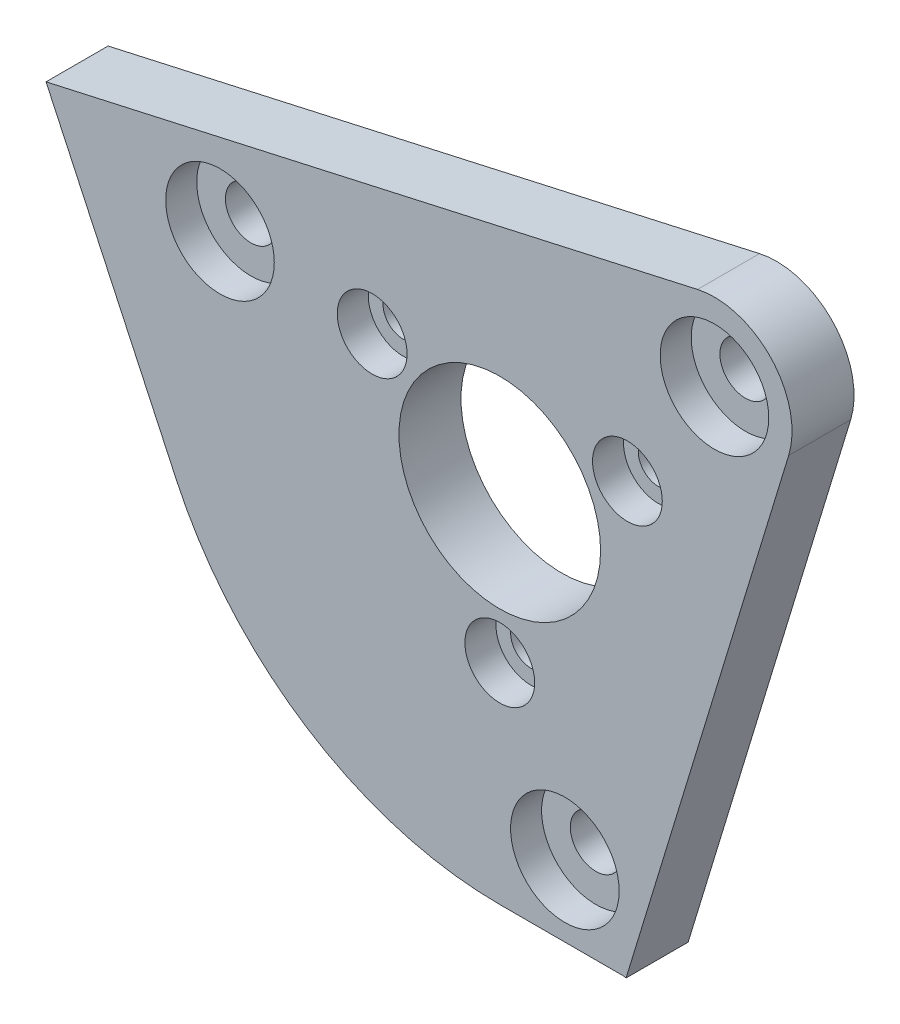
ISO-10303-21;
HEADER;
FILE_DESCRIPTION(('STEP AP214'),'2;1');
FILE_NAME('part.step','',(''),(''),'','','');
FILE_SCHEMA(('AUTOMOTIVE_DESIGN { 1 0 10303 214 1 1 1 1 }'));
ENDSEC;
DATA;
#1=APPLICATION_CONTEXT('core data for automotive mechanical design processes');
#2=APPLICATION_PROTOCOL_DEFINITION('international standard','automotive_design',2000,#1);
#3=PRODUCT_CONTEXT('',#1,'mechanical');
#4=PRODUCT('Part','Part','',(#3));
#5=PRODUCT_RELATED_PRODUCT_CATEGORY('part','',(#4));
#6=PRODUCT_DEFINITION_FORMATION('','',#4);
#7=PRODUCT_DEFINITION_CONTEXT('part definition',#1,'design');
#8=PRODUCT_DEFINITION('design','',#6,#7);
#9=PRODUCT_DEFINITION_SHAPE('','',#8);
#10=(LENGTH_UNIT() NAMED_UNIT(*) SI_UNIT(.MILLI.,.METRE.));
#11=(NAMED_UNIT(*) PLANE_ANGLE_UNIT() SI_UNIT($,.RADIAN.));
#12=(NAMED_UNIT(*) SI_UNIT($,.STERADIAN.) SOLID_ANGLE_UNIT());
#13=UNCERTAINTY_MEASURE_WITH_UNIT(LENGTH_MEASURE(1.E-05),#10,'distance_accuracy_value','');
#14=(GEOMETRIC_REPRESENTATION_CONTEXT(3) GLOBAL_UNCERTAINTY_ASSIGNED_CONTEXT((#13)) GLOBAL_UNIT_ASSIGNED_CONTEXT((#10,
#11,#12)) REPRESENTATION_CONTEXT('',''));
#15=CARTESIAN_POINT('',(0.,0.,0.));
#16=DIRECTION('',(0.,0.,1.));
#17=DIRECTION('',(1.,0.,0.));
#18=AXIS2_PLACEMENT_3D('',#15,#16,#17);
#19=CARTESIAN_POINT('',(16.7807030528475,10.1781626018077,4.));
#20=DIRECTION('',(0.,0.,-1.));
#21=DIRECTION('',(-1.,0.,0.));
#22=AXIS2_PLACEMENT_3D('',#19,#20,#21);
#23=CYLINDRICAL_SURFACE('',#22,1.30000000000001);
#24=CARTESIAN_POINT('',(16.7807030528475,10.1781626018077,0.));
#25=DIRECTION('',(0.,0.,1.));
#26=DIRECTION('',(1.,0.,0.));
#27=AXIS2_PLACEMENT_3D('',#24,#25,#26);
#28=CIRCLE('',#27,1.30000000000001);
#29=CARTESIAN_POINT('',(18.0807030528475,10.1781626018077,0.));
#30=VERTEX_POINT('',#29);
#31=EDGE_CURVE('E121',#30,#30,#28,.T.);
#32=ORIENTED_EDGE('',*,*,#31,.F.);
#33=EDGE_LOOP('',(#32));
#34=FACE_BOUND('',#33,.T.);
#35=CARTESIAN_POINT('',(16.7807030528475,10.1781626018077,2.));
#36=DIRECTION('',(0.,0.,1.));
#37=DIRECTION('',(1.,0.,0.));
#38=AXIS2_PLACEMENT_3D('',#35,#36,#37);
#39=CIRCLE('',#38,1.30000000000001);
#40=CARTESIAN_POINT('',(18.0807030528475,10.1781626018077,2.));
#41=VERTEX_POINT('',#40);
#42=EDGE_CURVE('E38',#41,#41,#39,.T.);
#43=ORIENTED_EDGE('',*,*,#42,.T.);
#44=EDGE_LOOP('',(#43));
#45=FACE_BOUND('',#44,.T.);
#46=ADVANCED_FACE('F34',(#34,#45),#23,.F.);
#47=CARTESIAN_POINT('',(8.55346171689525,-4.07183739819241,4.));
#48=DIRECTION('',(0.,0.,-1.));
#49=DIRECTION('',(-1.,0.,0.));
#50=AXIS2_PLACEMENT_3D('',#47,#48,#49);
#51=CYLINDRICAL_SURFACE('',#50,1.30000000000001);
#52=CARTESIAN_POINT('',(8.55346171689525,-4.07183739819241,0.));
#53=DIRECTION('',(0.,0.,1.));
#54=DIRECTION('',(1.,0.,0.));
#55=AXIS2_PLACEMENT_3D('',#52,#53,#54);
#56=CIRCLE('',#55,1.30000000000001);
#57=CARTESIAN_POINT('',(9.85346171689526,-4.07183739819241,0.));
#58=VERTEX_POINT('',#57);
#59=EDGE_CURVE('E125',#58,#58,#56,.T.);
#60=ORIENTED_EDGE('',*,*,#59,.F.);
#61=EDGE_LOOP('',(#60));
#62=FACE_BOUND('',#61,.T.);
#63=CARTESIAN_POINT('',(8.55346171689525,-4.07183739819241,2.));
#64=DIRECTION('',(0.,0.,1.));
#65=DIRECTION('',(1.,0.,0.));
#66=AXIS2_PLACEMENT_3D('',#63,#64,#65);
#67=CIRCLE('',#66,1.30000000000001);
#68=CARTESIAN_POINT('',(9.85346171689526,-4.07183739819241,2.));
#69=VERTEX_POINT('',#68);
#70=EDGE_CURVE('E156',#69,#69,#67,.T.);
#71=ORIENTED_EDGE('',*,*,#70,.T.);
#72=EDGE_LOOP('',(#71));
#73=FACE_BOUND('',#72,.T.);
#74=ADVANCED_FACE('F253',(#62,#73),#51,.F.);
#75=CARTESIAN_POINT('',(0.326220380943043,10.1781626018077,4.));
#76=DIRECTION('',(0.,0.,-1.));
#77=DIRECTION('',(-1.,0.,0.));
#78=AXIS2_PLACEMENT_3D('',#75,#76,#77);
#79=CYLINDRICAL_SURFACE('',#78,1.30000000000001);
#80=CARTESIAN_POINT('',(0.326220380943043,10.1781626018077,0.));
#81=DIRECTION('',(0.,0.,1.));
#82=DIRECTION('',(1.,0.,0.));
#83=AXIS2_PLACEMENT_3D('',#80,#81,#82);
#84=CIRCLE('',#83,1.30000000000001);
#85=CARTESIAN_POINT('',(1.62622038094305,10.1781626018077,0.));
#86=VERTEX_POINT('',#85);
#87=EDGE_CURVE('E221',#86,#86,#84,.T.);
#88=ORIENTED_EDGE('',*,*,#87,.F.);
#89=EDGE_LOOP('',(#88));
#90=FACE_BOUND('',#89,.T.);
#91=CARTESIAN_POINT('',(0.326220380943043,10.1781626018077,2.));
#92=DIRECTION('',(0.,0.,1.));
#93=DIRECTION('',(1.,0.,0.));
#94=AXIS2_PLACEMENT_3D('',#91,#92,#93);
#95=CIRCLE('',#94,1.30000000000001);
#96=CARTESIAN_POINT('',(1.62622038094305,10.1781626018077,2.));
#97=VERTEX_POINT('',#96);
#98=EDGE_CURVE('E154',#97,#97,#95,.T.);
#99=ORIENTED_EDGE('',*,*,#98,.T.);
#100=EDGE_LOOP('',(#99));
#101=FACE_BOUND('',#100,.T.);
#102=ADVANCED_FACE('F259',(#90,#101),#79,.F.);
#103=CARTESIAN_POINT('',(12.7495371740883,-12.9760797990297,-6.));
#104=DIRECTION('',(0.,0.,1.));
#105=DIRECTION('',(1.,0.,0.));
#106=AXIS2_PLACEMENT_3D('',#103,#104,#105);
#107=CYLINDRICAL_SURFACE('',#106,1.65);
#108=CARTESIAN_POINT('',(12.7495371740883,-12.9760797990297,0.));
#109=DIRECTION('',(0.,0.,1.));
#110=DIRECTION('',(1.,0.,0.));
#111=AXIS2_PLACEMENT_3D('',#108,#109,#110);
#112=CIRCLE('',#111,1.65);
#113=CARTESIAN_POINT('',(14.3995371740883,-12.9760797990297,0.));
#114=VERTEX_POINT('',#113);
#115=EDGE_CURVE('E136',#114,#114,#112,.T.);
#116=ORIENTED_EDGE('',*,*,#115,.F.);
#117=EDGE_LOOP('',(#116));
#118=FACE_BOUND('',#117,.T.);
#119=CARTESIAN_POINT('',(12.7495371740883,-12.9760797990297,2.));
#120=DIRECTION('',(0.,0.,1.));
#121=DIRECTION('',(1.,0.,0.));
#122=AXIS2_PLACEMENT_3D('',#119,#120,#121);
#123=CIRCLE('',#122,1.65);
#124=CARTESIAN_POINT('',(14.3995371740883,-12.9760797990297,2.));
#125=VERTEX_POINT('',#124);
#126=EDGE_CURVE('E151',#125,#125,#123,.F.);
#127=ORIENTED_EDGE('',*,*,#126,.F.);
#128=EDGE_LOOP('',(#127));
#129=FACE_BOUND('',#128,.T.);
#130=ADVANCED_FACE('F287',(#118,#129),#107,.F.);
#131=CARTESIAN_POINT('',(-9.48311746823312,10.9963758601007,-6.));
#132=DIRECTION('',(0.,0.,1.));
#133=DIRECTION('',(1.,0.,0.));
#134=AXIS2_PLACEMENT_3D('',#131,#132,#133);
#135=CYLINDRICAL_SURFACE('',#134,1.65);
#136=CARTESIAN_POINT('',(-9.48311746823312,10.9963758601007,0.));
#137=DIRECTION('',(0.,0.,1.));
#138=DIRECTION('',(1.,0.,0.));
#139=AXIS2_PLACEMENT_3D('',#136,#137,#138);
#140=CIRCLE('',#139,1.65);
#141=CARTESIAN_POINT('',(-7.83311746823312,10.9963758601007,0.));
#142=VERTEX_POINT('',#141);
#143=EDGE_CURVE('E139',#142,#142,#140,.T.);
#144=ORIENTED_EDGE('',*,*,#143,.F.);
#145=EDGE_LOOP('',(#144));
#146=FACE_BOUND('',#145,.T.);
#147=CARTESIAN_POINT('',(-9.48311746823312,10.9963758601007,2.));
#148=DIRECTION('',(0.,0.,1.));
#149=DIRECTION('',(1.,0.,0.));
#150=AXIS2_PLACEMENT_3D('',#147,#148,#149);
#151=CIRCLE('',#150,1.65);
#152=CARTESIAN_POINT('',(-7.83311746823312,10.9963758601007,2.));
#153=VERTEX_POINT('',#152);
#154=EDGE_CURVE('E147',#153,#153,#151,.F.);
#155=ORIENTED_EDGE('',*,*,#154,.F.);
#156=EDGE_LOOP('',(#155));
#157=FACE_BOUND('',#156,.T.);
#158=ADVANCED_FACE('F296',(#146,#157),#135,.F.);
#159=CARTESIAN_POINT('',(22.3939654448306,18.2641917443519,-6.));
#160=DIRECTION('',(0.,0.,1.));
#161=DIRECTION('',(1.,0.,0.));
#162=AXIS2_PLACEMENT_3D('',#159,#160,#161);
#163=CYLINDRICAL_SURFACE('',#162,1.65);
#164=CARTESIAN_POINT('',(22.3939654448306,18.2641917443519,0.));
#165=DIRECTION('',(0.,0.,1.));
#166=DIRECTION('',(1.,0.,0.));
#167=AXIS2_PLACEMENT_3D('',#164,#165,#166);
#168=CIRCLE('',#167,1.65);
#169=CARTESIAN_POINT('',(24.0439654448306,18.2641917443519,0.));
#170=VERTEX_POINT('',#169);
#171=EDGE_CURVE('E115',#170,#170,#168,.T.);
#172=ORIENTED_EDGE('',*,*,#171,.F.);
#173=EDGE_LOOP('',(#172));
#174=FACE_BOUND('',#173,.T.);
#175=CARTESIAN_POINT('',(22.3939654448306,18.2641917443519,2.));
#176=DIRECTION('',(0.,0.,1.));
#177=DIRECTION('',(1.,0.,0.));
#178=AXIS2_PLACEMENT_3D('',#175,#176,#177);
#179=CIRCLE('',#178,1.65);
#180=CARTESIAN_POINT('',(24.0439654448306,18.2641917443519,2.));
#181=VERTEX_POINT('',#180);
#182=EDGE_CURVE('E144',#181,#181,#179,.F.);
#183=ORIENTED_EDGE('',*,*,#182,.F.);
#184=EDGE_LOOP('',(#183));
#185=FACE_BOUND('',#184,.T.);
#186=ADVANCED_FACE('F267',(#174,#185),#163,.F.);
#187=CARTESIAN_POINT('',(8.55346171689528,5.42816260180768,4.));
#188=DIRECTION('',(0.,0.,1.));
#189=DIRECTION('',(1.,0.,0.));
#190=AXIS2_PLACEMENT_3D('',#187,#188,#189);
#191=PLANE('',#190);
#192=CARTESIAN_POINT('',(22.3939654448306,18.2641917443519,4.));
#193=DIRECTION('',(0.,0.,1.));
#194=DIRECTION('',(1.,0.,0.));
#195=AXIS2_PLACEMENT_3D('',#192,#193,#194);
#196=CIRCLE('',#195,3.5);
#197=CARTESIAN_POINT('',(25.8939654448306,18.2641917443519,4.));
#198=VERTEX_POINT('',#197);
#199=EDGE_CURVE('E187',#198,#198,#196,.T.);
#200=ORIENTED_EDGE('',*,*,#199,.F.);
#201=EDGE_LOOP('',(#200));
#202=FACE_BOUND('',#201,.T.);
#203=CARTESIAN_POINT('',(0.326220380943043,10.1781626018077,4.));
#204=DIRECTION('',(0.,0.,1.));
#205=DIRECTION('',(1.,0.,0.));
#206=AXIS2_PLACEMENT_3D('',#203,#204,#205);
#207=CIRCLE('',#206,2.25);
#208=CARTESIAN_POINT('',(2.57622038094304,10.1781626018077,4.));
#209=VERTEX_POINT('',#208);
#210=EDGE_CURVE('E352',#209,#209,#207,.T.);
#211=ORIENTED_EDGE('',*,*,#210,.F.);
#212=EDGE_LOOP('',(#211));
#213=FACE_BOUND('',#212,.T.);
#214=CARTESIAN_POINT('',(-9.48311746823312,10.9963758601007,4.));
#215=DIRECTION('',(0.,0.,1.));
#216=DIRECTION('',(1.,0.,0.));
#217=AXIS2_PLACEMENT_3D('',#214,#215,#216);
#218=CIRCLE('',#217,3.5);
#219=CARTESIAN_POINT('',(-5.98311746823312,10.9963758601007,4.));
#220=VERTEX_POINT('',#219);
#221=EDGE_CURVE('E188',#220,#220,#218,.T.);
#222=ORIENTED_EDGE('',*,*,#221,.F.);
#223=EDGE_LOOP('',(#222));
#224=FACE_BOUND('',#223,.T.);
#225=CARTESIAN_POINT('',(12.7495371740883,-12.9760797990297,4.));
#226=DIRECTION('',(0.,0.,1.));
#227=DIRECTION('',(1.,0.,0.));
#228=AXIS2_PLACEMENT_3D('',#225,#226,#227);
#229=CIRCLE('',#228,3.5);
#230=CARTESIAN_POINT('',(16.2495371740883,-12.9760797990297,4.));
#231=VERTEX_POINT('',#230);
#232=EDGE_CURVE('E194',#231,#231,#229,.T.);
#233=ORIENTED_EDGE('',*,*,#232,.F.);
#234=EDGE_LOOP('',(#233));
#235=FACE_BOUND('',#234,.T.);
#236=CARTESIAN_POINT('',(8.55346171689525,-4.07183739819241,4.));
#237=DIRECTION('',(0.,0.,1.));
#238=DIRECTION('',(1.,0.,0.));
#239=AXIS2_PLACEMENT_3D('',#236,#237,#238);
#240=CIRCLE('',#239,2.25);
#241=CARTESIAN_POINT('',(10.8034617168952,-4.07183739819241,4.));
#242=VERTEX_POINT('',#241);
#243=EDGE_CURVE('E173',#242,#242,#240,.T.);
#244=ORIENTED_EDGE('',*,*,#243,.F.);
#245=EDGE_LOOP('',(#244));
#246=FACE_BOUND('',#245,.T.);
#247=CARTESIAN_POINT('',(16.7807030528475,10.1781626018077,4.));
#248=DIRECTION('',(0.,0.,1.));
#249=DIRECTION('',(1.,0.,0.));
#250=AXIS2_PLACEMENT_3D('',#247,#248,#249);
#251=CIRCLE('',#250,2.25);
#252=CARTESIAN_POINT('',(19.0307030528475,10.1781626018077,4.));
#253=VERTEX_POINT('',#252);
#254=EDGE_CURVE('E174',#253,#253,#251,.T.);
#255=ORIENTED_EDGE('',*,*,#254,.F.);
#256=EDGE_LOOP('',(#255));
#257=FACE_BOUND('',#256,.T.);
#258=CARTESIAN_POINT('',(8.55346171689528,5.42816260180768,4.));
#259=DIRECTION('',(0.,0.,1.));
#260=DIRECTION('',(1.,0.,0.));
#261=AXIS2_PLACEMENT_3D('',#258,#259,#260);
#262=CIRCLE('',#261,6.50000000000001);
#263=CARTESIAN_POINT('',(15.0534617168953,5.42816260180768,4.));
#264=VERTEX_POINT('',#263);
#265=EDGE_CURVE('E225',#264,#264,#262,.T.);
#266=ORIENTED_EDGE('',*,*,#265,.F.);
#267=EDGE_LOOP('',(#266));
#268=FACE_BOUND('',#267,.T.);
#269=DIRECTION('',(0.291366274341778,0.956611569121026,0.));
#270=VECTOR('',#269,1.);
#271=CARTESIAN_POINT('',(16.5534617168953,-18.0718373981923,4.));
#272=LINE('',#271,#270);
#273=CARTESIAN_POINT('',(16.6965389787978,-17.6020872037909,4.));
#274=VERTEX_POINT('',#273);
#275=CARTESIAN_POINT('',(27.1770232904357,16.807360372643,4.));
#276=VERTEX_POINT('',#275);
#277=EDGE_CURVE('E100',#274,#276,#272,.T.);
#278=ORIENTED_EDGE('',*,*,#277,.T.);
#279=CARTESIAN_POINT('',(22.3939654448306,18.2641917443519,4.));
#280=DIRECTION('',(0.,0.,1.));
#281=DIRECTION('',(1.,0.,0.));
#282=AXIS2_PLACEMENT_3D('',#279,#280,#281);
#283=CIRCLE('',#282,5.);
#284=CARTESIAN_POINT('',(21.3009505151589,23.1432611600822,4.));
#285=VERTEX_POINT('',#284);
#286=EDGE_CURVE('E58',#276,#285,#283,.T.);
#287=ORIENTED_EDGE('',*,*,#286,.T.);
#288=DIRECTION('',(-0.975813883146058,-0.218602985934344,0.));
#289=VECTOR('',#288,1.);
#290=CARTESIAN_POINT('',(5.38371842084726,19.5774639074255,4.));
#291=LINE('',#290,#289);
#292=CARTESIAN_POINT('',(-20.6976276465554,13.7346897616638,4.));
#293=VERTEX_POINT('',#292);
#294=EDGE_CURVE('E128',#285,#293,#291,.T.);
#295=ORIENTED_EDGE('',*,*,#294,.T.);
#296=DIRECTION('',(0.422618261740697,-0.906307787036651,0.));
#297=VECTOR('',#296,1.);
#298=CARTESIAN_POINT('',(-20.7439826197616,13.8340983225047,4.));
#299=LINE('',#298,#297);
#300=CARTESIAN_POINT('',(-12.2916173849477,-4.29205741822838,4.));
#301=VERTEX_POINT('',#300);
#302=EDGE_CURVE('E204',#293,#301,#299,.T.);
#303=ORIENTED_EDGE('',*,*,#302,.T.);
#304=CARTESIAN_POINT('',(8.55346171689528,5.42816260180768,4.));
#305=DIRECTION('',(0.,0.,1.));
#306=DIRECTION('',(1.,0.,0.));
#307=AXIS2_PLACEMENT_3D('',#304,#305,#306);
#308=CIRCLE('',#307,23.);
#309=CARTESIAN_POINT('',(8.55346171689528,-17.5718373981923,4.));
#310=VERTEX_POINT('',#309);
#311=EDGE_CURVE('E207',#301,#310,#308,.T.);
#312=ORIENTED_EDGE('',*,*,#311,.T.);
#313=DIRECTION('',(1.,0.,0.));
#314=VECTOR('',#313,1.);
#315=CARTESIAN_POINT('',(8.55346171689528,-17.5718373981923,4.));
#316=LINE('',#315,#314);
#317=CARTESIAN_POINT('',(16.5534617168953,-17.5718373981923,4.));
#318=VERTEX_POINT('',#317);
#319=EDGE_CURVE('E210',#310,#318,#316,.T.);
#320=ORIENTED_EDGE('',*,*,#319,.T.);
#321=DIRECTION('',(-0.978372595322692,0.206850343779121,0.));
#322=VECTOR('',#321,1.);
#323=CARTESIAN_POINT('',(21.4054789841989,-18.5976648227973,4.));
#324=LINE('',#323,#322);
#325=EDGE_CURVE('E213',#274,#318,#324,.T.);
#326=ORIENTED_EDGE('',*,*,#325,.F.);
#327=EDGE_LOOP('',(#278,#287,#295,#303,#312,#320,#326));
#328=FACE_BOUND('',#327,.T.);
#329=ADVANCED_FACE('F232',(#202,#213,#224,#235,#246,#257,#268,#328),#191,.T.);
#330=CARTESIAN_POINT('',(5.38371842084726,19.5774639074255,4.));
#331=DIRECTION('',(0.218602985934344,-0.975813883146058,0.));
#332=DIRECTION('',(0.975813883146058,0.218602985934344,0.));
#333=AXIS2_PLACEMENT_3D('',#330,#331,#332);
#334=PLANE('',#333);
#335=ORIENTED_EDGE('',*,*,#294,.F.);
#336=DIRECTION('',(0.,0.,1.));
#337=VECTOR('',#336,1.);
#338=CARTESIAN_POINT('',(21.3009505151589,23.1432611600822,4.));
#339=LINE('',#338,#337);
#340=CARTESIAN_POINT('',(21.3009505151589,23.1432611600822,0.));
#341=VERTEX_POINT('',#340);
#342=EDGE_CURVE('E43',#285,#341,#339,.F.);
#343=ORIENTED_EDGE('',*,*,#342,.T.);
#344=DIRECTION('',(-0.975813883146058,-0.218602985934344,0.));
#345=VECTOR('',#344,1.);
#346=CARTESIAN_POINT('',(5.38371842084726,19.5774639074255,0.));
#347=LINE('',#346,#345);
#348=CARTESIAN_POINT('',(-20.6976276465554,13.7346897616638,0.));
#349=VERTEX_POINT('',#348);
#350=EDGE_CURVE('E120',#341,#349,#347,.T.);
#351=ORIENTED_EDGE('',*,*,#350,.T.);
#352=DIRECTION('',(0.,0.,-1.));
#353=VECTOR('',#352,1.);
#354=CARTESIAN_POINT('',(-20.6976276465554,13.7346897616638,4.));
#355=LINE('',#354,#353);
#356=EDGE_CURVE('E104',#293,#349,#355,.T.);
#357=ORIENTED_EDGE('',*,*,#356,.F.);
#358=EDGE_LOOP('',(#335,#343,#351,#357));
#359=FACE_BOUND('',#358,.T.);
#360=ADVANCED_FACE('F237',(#359),#334,.F.);
#361=CARTESIAN_POINT('',(8.55346171689528,5.42816260180768,0.));
#362=DIRECTION('',(0.,0.,1.));
#363=DIRECTION('',(1.,0.,0.));
#364=AXIS2_PLACEMENT_3D('',#361,#362,#363);
#365=PLANE('',#364);
#366=ORIENTED_EDGE('',*,*,#171,.T.);
#367=EDGE_LOOP('',(#366));
#368=FACE_BOUND('',#367,.T.);
#369=ORIENTED_EDGE('',*,*,#143,.T.);
#370=EDGE_LOOP('',(#369));
#371=FACE_BOUND('',#370,.T.);
#372=ORIENTED_EDGE('',*,*,#115,.T.);
#373=EDGE_LOOP('',(#372));
#374=FACE_BOUND('',#373,.T.);
#375=ORIENTED_EDGE('',*,*,#350,.F.);
#376=CARTESIAN_POINT('',(22.3939654448306,18.2641917443519,0.));
#377=DIRECTION('',(0.,0.,1.));
#378=DIRECTION('',(1.,0.,0.));
#379=AXIS2_PLACEMENT_3D('',#376,#377,#378);
#380=CIRCLE('',#379,5.);
#381=CARTESIAN_POINT('',(27.1770232904357,16.807360372643,0.));
#382=VERTEX_POINT('',#381);
#383=EDGE_CURVE('E11',#341,#382,#380,.F.);
#384=ORIENTED_EDGE('',*,*,#383,.T.);
#385=DIRECTION('',(0.291366274341778,0.956611569121026,0.));
#386=VECTOR('',#385,1.);
#387=CARTESIAN_POINT('',(16.5534617168953,-18.0718373981923,0.));
#388=LINE('',#387,#386);
#389=CARTESIAN_POINT('',(16.6965389787978,-17.6020872037909,0.));
#390=VERTEX_POINT('',#389);
#391=EDGE_CURVE('E98',#390,#382,#388,.T.);
#392=ORIENTED_EDGE('',*,*,#391,.F.);
#393=DIRECTION('',(-0.978372595322693,0.206850343779114,0.));
#394=VECTOR('',#393,1.);
#395=CARTESIAN_POINT('',(4.24109395787663,-14.9687212481044,0.));
#396=LINE('',#395,#394);
#397=CARTESIAN_POINT('',(16.5534617168953,-17.5718373981923,0.));
#398=VERTEX_POINT('',#397);
#399=EDGE_CURVE('E107',#390,#398,#396,.T.);
#400=ORIENTED_EDGE('',*,*,#399,.T.);
#401=DIRECTION('',(-1.,0.,0.));
#402=VECTOR('',#401,1.);
#403=CARTESIAN_POINT('',(8.55346171689532,-17.5718373981923,0.));
#404=LINE('',#403,#402);
#405=CARTESIAN_POINT('',(8.55346171689528,-17.5718373981923,0.));
#406=VERTEX_POINT('',#405);
#407=EDGE_CURVE('E199',#398,#406,#404,.T.);
#408=ORIENTED_EDGE('',*,*,#407,.T.);
#409=CARTESIAN_POINT('',(8.55346171689528,5.42816260180768,0.));
#410=DIRECTION('',(0.,0.,1.));
#411=DIRECTION('',(1.,0.,0.));
#412=AXIS2_PLACEMENT_3D('',#409,#410,#411);
#413=CIRCLE('',#412,23.);
#414=CARTESIAN_POINT('',(-12.2916173849477,-4.29205741822837,0.));
#415=VERTEX_POINT('',#414);
#416=EDGE_CURVE('E114',#406,#415,#413,.F.);
#417=ORIENTED_EDGE('',*,*,#416,.T.);
#418=DIRECTION('',(-0.422618261740696,0.906307787036651,0.));
#419=VECTOR('',#418,1.);
#420=CARTESIAN_POINT('',(-12.2916173849477,-4.29205741822834,0.));
#421=LINE('',#420,#419);
#422=EDGE_CURVE('E201',#415,#349,#421,.T.);
#423=ORIENTED_EDGE('',*,*,#422,.T.);
#424=EDGE_LOOP('',(#375,#384,#392,#400,#408,#417,#423));
#425=FACE_BOUND('',#424,.T.);
#426=ORIENTED_EDGE('',*,*,#31,.T.);
#427=EDGE_LOOP('',(#426));
#428=FACE_BOUND('',#427,.T.);
#429=ORIENTED_EDGE('',*,*,#59,.T.);
#430=EDGE_LOOP('',(#429));
#431=FACE_BOUND('',#430,.T.);
#432=CARTESIAN_POINT('',(8.55346171689528,5.42816260180768,0.));
#433=DIRECTION('',(0.,0.,1.));
#434=DIRECTION('',(1.,0.,0.));
#435=AXIS2_PLACEMENT_3D('',#432,#433,#434);
#436=CIRCLE('',#435,6.50000000000001);
#437=CARTESIAN_POINT('',(15.0534617168953,5.42816260180768,0.));
#438=VERTEX_POINT('',#437);
#439=EDGE_CURVE('E224',#438,#438,#436,.T.);
#440=ORIENTED_EDGE('',*,*,#439,.T.);
#441=EDGE_LOOP('',(#440));
#442=FACE_BOUND('',#441,.T.);
#443=ORIENTED_EDGE('',*,*,#87,.T.);
#444=EDGE_LOOP('',(#443));
#445=FACE_BOUND('',#444,.T.);
#446=ADVANCED_FACE('F117',(#368,#371,#374,#425,#428,#431,#442,#445),#365,.F.);
#447=CARTESIAN_POINT('',(16.5534617168953,-18.0718373981923,4.));
#448=DIRECTION('',(-0.956611569121026,0.291366274341778,0.));
#449=DIRECTION('',(-0.291366274341778,-0.956611569121026,0.));
#450=AXIS2_PLACEMENT_3D('',#447,#448,#449);
#451=PLANE('',#450);
#452=ORIENTED_EDGE('',*,*,#391,.T.);
#453=DIRECTION('',(0.,0.,1.));
#454=VECTOR('',#453,1.);
#455=CARTESIAN_POINT('',(27.1770232904357,16.807360372643,4.));
#456=LINE('',#455,#454);
#457=EDGE_CURVE('E103',#382,#276,#456,.T.);
#458=ORIENTED_EDGE('',*,*,#457,.T.);
#459=ORIENTED_EDGE('',*,*,#277,.F.);
#460=DIRECTION('',(0.,0.,-1.));
#461=VECTOR('',#460,1.);
#462=CARTESIAN_POINT('',(16.6965389787978,-17.6020872037909,4.));
#463=LINE('',#462,#461);
#464=EDGE_CURVE('E93',#274,#390,#463,.T.);
#465=ORIENTED_EDGE('',*,*,#464,.T.);
#466=EDGE_LOOP('',(#452,#458,#459,#465));
#467=FACE_BOUND('',#466,.T.);
#468=ADVANCED_FACE('F95',(#467),#451,.F.);
#469=CARTESIAN_POINT('',(8.55346171689528,5.42816260180768,4.));
#470=DIRECTION('',(0.,0.,-1.));
#471=DIRECTION('',(-1.,0.,0.));
#472=AXIS2_PLACEMENT_3D('',#469,#470,#471);
#473=CYLINDRICAL_SURFACE('',#472,6.50000000000001);
#474=ORIENTED_EDGE('',*,*,#265,.T.);
#475=EDGE_LOOP('',(#474));
#476=FACE_BOUND('',#475,.T.);
#477=ORIENTED_EDGE('',*,*,#439,.F.);
#478=EDGE_LOOP('',(#477));
#479=FACE_BOUND('',#478,.T.);
#480=ADVANCED_FACE('F274',(#476,#479),#473,.F.);
#481=CARTESIAN_POINT('',(21.4054789841989,-18.5976648227973,2.));
#482=DIRECTION('',(0.206850343779121,0.978372595322692,0.));
#483=DIRECTION('',(-0.978372595322692,0.206850343779121,0.));
#484=AXIS2_PLACEMENT_3D('',#481,#482,#483);
#485=PLANE('',#484);
#486=ORIENTED_EDGE('',*,*,#325,.T.);
#487=DIRECTION('',(0.,0.,1.));
#488=VECTOR('',#487,1.);
#489=CARTESIAN_POINT('',(16.5534617168953,-17.5718373981923,2.));
#490=LINE('',#489,#488);
#491=EDGE_CURVE('E110',#398,#318,#490,.T.);
#492=ORIENTED_EDGE('',*,*,#491,.F.);
#493=ORIENTED_EDGE('',*,*,#399,.F.);
#494=ORIENTED_EDGE('',*,*,#464,.F.);
#495=EDGE_LOOP('',(#486,#492,#493,#494));
#496=FACE_BOUND('',#495,.T.);
#497=ADVANCED_FACE('F108',(#496),#485,.F.);
#498=CARTESIAN_POINT('',(-20.7439826197616,13.8340983225047,2.));
#499=DIRECTION('',(-0.906307787036651,-0.422618261740697,0.));
#500=DIRECTION('',(0.422618261740697,-0.906307787036651,0.));
#501=AXIS2_PLACEMENT_3D('',#498,#499,#500);
#502=PLANE('',#501);
#503=ORIENTED_EDGE('',*,*,#356,.T.);
#504=ORIENTED_EDGE('',*,*,#422,.F.);
#505=DIRECTION('',(0.,0.,1.));
#506=VECTOR('',#505,1.);
#507=CARTESIAN_POINT('',(-12.2916173849477,-4.29205741822838,2.));
#508=LINE('',#507,#506);
#509=EDGE_CURVE('E218',#415,#301,#508,.T.);
#510=ORIENTED_EDGE('',*,*,#509,.T.);
#511=ORIENTED_EDGE('',*,*,#302,.F.);
#512=EDGE_LOOP('',(#503,#504,#510,#511));
#513=FACE_BOUND('',#512,.T.);
#514=ADVANCED_FACE('F235',(#513),#502,.T.);
#515=CARTESIAN_POINT('',(8.55346171689528,5.42816260180768,2.));
#516=DIRECTION('',(0.,0.,1.));
#517=DIRECTION('',(1.,0.,0.));
#518=AXIS2_PLACEMENT_3D('',#515,#516,#517);
#519=CYLINDRICAL_SURFACE('',#518,23.);
#520=ORIENTED_EDGE('',*,*,#311,.F.);
#521=ORIENTED_EDGE('',*,*,#509,.F.);
#522=ORIENTED_EDGE('',*,*,#416,.F.);
#523=DIRECTION('',(0.,0.,1.));
#524=VECTOR('',#523,1.);
#525=CARTESIAN_POINT('',(8.55346171689528,-17.5718373981923,2.));
#526=LINE('',#525,#524);
#527=EDGE_CURVE('E216',#406,#310,#526,.T.);
#528=ORIENTED_EDGE('',*,*,#527,.T.);
#529=EDGE_LOOP('',(#520,#521,#522,#528));
#530=FACE_BOUND('',#529,.T.);
#531=ADVANCED_FACE('F249',(#530),#519,.T.);
#532=CARTESIAN_POINT('',(8.55346171689528,-17.5718373981923,2.));
#533=DIRECTION('',(0.,-1.,0.));
#534=DIRECTION('',(1.,0.,0.));
#535=AXIS2_PLACEMENT_3D('',#532,#533,#534);
#536=PLANE('',#535);
#537=ORIENTED_EDGE('',*,*,#319,.F.);
#538=ORIENTED_EDGE('',*,*,#527,.F.);
#539=ORIENTED_EDGE('',*,*,#407,.F.);
#540=ORIENTED_EDGE('',*,*,#491,.T.);
#541=EDGE_LOOP('',(#537,#538,#539,#540));
#542=FACE_BOUND('',#541,.T.);
#543=ADVANCED_FACE('F241',(#542),#536,.T.);
#544=CARTESIAN_POINT('',(22.3939654448306,18.2641917443519,4.));
#545=DIRECTION('',(0.,0.,1.));
#546=DIRECTION('',(1.,0.,0.));
#547=AXIS2_PLACEMENT_3D('',#544,#545,#546);
#548=CYLINDRICAL_SURFACE('',#547,5.);
#549=ORIENTED_EDGE('',*,*,#383,.F.);
#550=ORIENTED_EDGE('',*,*,#342,.F.);
#551=ORIENTED_EDGE('',*,*,#286,.F.);
#552=ORIENTED_EDGE('',*,*,#457,.F.);
#553=EDGE_LOOP('',(#549,#550,#551,#552));
#554=FACE_BOUND('',#553,.T.);
#555=ADVANCED_FACE('F36',(#554),#548,.T.);
#556=CARTESIAN_POINT('',(22.3939654448306,18.2641917443519,2.));
#557=DIRECTION('',(0.,0.,1.));
#558=DIRECTION('',(1.,0.,0.));
#559=AXIS2_PLACEMENT_3D('',#556,#557,#558);
#560=PLANE('',#559);
#561=CARTESIAN_POINT('',(22.3939654448306,18.2641917443519,2.));
#562=DIRECTION('',(0.,0.,1.));
#563=DIRECTION('',(1.,0.,0.));
#564=AXIS2_PLACEMENT_3D('',#561,#562,#563);
#565=CIRCLE('',#564,3.5);
#566=CARTESIAN_POINT('',(25.8939654448306,18.2641917443519,2.));
#567=VERTEX_POINT('',#566);
#568=EDGE_CURVE('E148',#567,#567,#565,.T.);
#569=ORIENTED_EDGE('',*,*,#568,.T.);
#570=EDGE_LOOP('',(#569));
#571=FACE_BOUND('',#570,.T.);
#572=ORIENTED_EDGE('',*,*,#182,.T.);
#573=EDGE_LOOP('',(#572));
#574=FACE_BOUND('',#573,.T.);
#575=ADVANCED_FACE('F240',(#571,#574),#560,.T.);
#576=CARTESIAN_POINT('',(22.3939654448306,18.2641917443519,2.));
#577=DIRECTION('',(0.,0.,1.));
#578=DIRECTION('',(1.,0.,0.));
#579=AXIS2_PLACEMENT_3D('',#576,#577,#578);
#580=CYLINDRICAL_SURFACE('',#579,3.5);
#581=ORIENTED_EDGE('',*,*,#568,.F.);
#582=EDGE_LOOP('',(#581));
#583=FACE_BOUND('',#582,.T.);
#584=ORIENTED_EDGE('',*,*,#199,.T.);
#585=EDGE_LOOP('',(#584));
#586=FACE_BOUND('',#585,.T.);
#587=ADVANCED_FACE('F246',(#583,#586),#580,.F.);
#588=CARTESIAN_POINT('',(-9.48311746823312,10.9963758601007,2.));
#589=DIRECTION('',(0.,0.,1.));
#590=DIRECTION('',(1.,0.,0.));
#591=AXIS2_PLACEMENT_3D('',#588,#589,#590);
#592=PLANE('',#591);
#593=CARTESIAN_POINT('',(-9.48311746823312,10.9963758601007,2.));
#594=DIRECTION('',(0.,0.,1.));
#595=DIRECTION('',(1.,0.,0.));
#596=AXIS2_PLACEMENT_3D('',#593,#594,#595);
#597=CIRCLE('',#596,3.5);
#598=CARTESIAN_POINT('',(-5.98311746823312,10.9963758601007,2.));
#599=VERTEX_POINT('',#598);
#600=EDGE_CURVE('E184',#599,#599,#597,.T.);
#601=ORIENTED_EDGE('',*,*,#600,.T.);
#602=EDGE_LOOP('',(#601));
#603=FACE_BOUND('',#602,.T.);
#604=ORIENTED_EDGE('',*,*,#154,.T.);
#605=EDGE_LOOP('',(#604));
#606=FACE_BOUND('',#605,.T.);
#607=ADVANCED_FACE('F316',(#603,#606),#592,.T.);
#608=CARTESIAN_POINT('',(-9.48311746823312,10.9963758601007,2.));
#609=DIRECTION('',(0.,0.,1.));
#610=DIRECTION('',(1.,0.,0.));
#611=AXIS2_PLACEMENT_3D('',#608,#609,#610);
#612=CYLINDRICAL_SURFACE('',#611,3.5);
#613=ORIENTED_EDGE('',*,*,#600,.F.);
#614=EDGE_LOOP('',(#613));
#615=FACE_BOUND('',#614,.T.);
#616=ORIENTED_EDGE('',*,*,#221,.T.);
#617=EDGE_LOOP('',(#616));
#618=FACE_BOUND('',#617,.T.);
#619=ADVANCED_FACE('F312',(#615,#618),#612,.F.);
#620=CARTESIAN_POINT('',(12.7495371740883,-12.9760797990297,2.));
#621=DIRECTION('',(0.,0.,1.));
#622=DIRECTION('',(1.,0.,0.));
#623=AXIS2_PLACEMENT_3D('',#620,#621,#622);
#624=PLANE('',#623);
#625=CARTESIAN_POINT('',(12.7495371740883,-12.9760797990297,2.));
#626=DIRECTION('',(0.,0.,1.));
#627=DIRECTION('',(1.,0.,0.));
#628=AXIS2_PLACEMENT_3D('',#625,#626,#627);
#629=CIRCLE('',#628,3.5);
#630=CARTESIAN_POINT('',(16.2495371740883,-12.9760797990297,2.));
#631=VERTEX_POINT('',#630);
#632=EDGE_CURVE('E191',#631,#631,#629,.T.);
#633=ORIENTED_EDGE('',*,*,#632,.T.);
#634=EDGE_LOOP('',(#633));
#635=FACE_BOUND('',#634,.T.);
#636=ORIENTED_EDGE('',*,*,#126,.T.);
#637=EDGE_LOOP('',(#636));
#638=FACE_BOUND('',#637,.T.);
#639=ADVANCED_FACE('F308',(#635,#638),#624,.T.);
#640=CARTESIAN_POINT('',(12.7495371740883,-12.9760797990297,2.));
#641=DIRECTION('',(0.,0.,1.));
#642=DIRECTION('',(1.,0.,0.));
#643=AXIS2_PLACEMENT_3D('',#640,#641,#642);
#644=CYLINDRICAL_SURFACE('',#643,3.5);
#645=ORIENTED_EDGE('',*,*,#632,.F.);
#646=EDGE_LOOP('',(#645));
#647=FACE_BOUND('',#646,.T.);
#648=ORIENTED_EDGE('',*,*,#232,.T.);
#649=EDGE_LOOP('',(#648));
#650=FACE_BOUND('',#649,.T.);
#651=ADVANCED_FACE('F304',(#647,#650),#644,.F.);
#652=CARTESIAN_POINT('',(0.326220380943043,10.1781626018077,2.));
#653=DIRECTION('',(0.,0.,1.));
#654=DIRECTION('',(1.,0.,0.));
#655=AXIS2_PLACEMENT_3D('',#652,#653,#654);
#656=CYLINDRICAL_SURFACE('',#655,2.25);
#657=CARTESIAN_POINT('',(0.326220380943043,10.1781626018077,2.));
#658=DIRECTION('',(0.,0.,1.));
#659=DIRECTION('',(1.,0.,0.));
#660=AXIS2_PLACEMENT_3D('',#657,#658,#659);
#661=CIRCLE('',#660,2.25);
#662=CARTESIAN_POINT('',(2.57622038094304,10.1781626018077,2.));
#663=VERTEX_POINT('',#662);
#664=EDGE_CURVE('E180',#663,#663,#661,.T.);
#665=ORIENTED_EDGE('',*,*,#664,.F.);
#666=EDGE_LOOP('',(#665));
#667=FACE_BOUND('',#666,.T.);
#668=ORIENTED_EDGE('',*,*,#210,.T.);
#669=EDGE_LOOP('',(#668));
#670=FACE_BOUND('',#669,.T.);
#671=ADVANCED_FACE('F307',(#667,#670),#656,.F.);
#672=CARTESIAN_POINT('',(0.326220380943043,10.1781626018077,2.));
#673=DIRECTION('',(0.,0.,1.));
#674=DIRECTION('',(1.,0.,0.));
#675=AXIS2_PLACEMENT_3D('',#672,#673,#674);
#676=PLANE('',#675);
#677=ORIENTED_EDGE('',*,*,#98,.F.);
#678=EDGE_LOOP('',(#677));
#679=FACE_BOUND('',#678,.T.);
#680=ORIENTED_EDGE('',*,*,#664,.T.);
#681=EDGE_LOOP('',(#680));
#682=FACE_BOUND('',#681,.T.);
#683=ADVANCED_FACE('F327',(#679,#682),#676,.T.);
#684=CARTESIAN_POINT('',(8.55346171689525,-4.07183739819241,2.));
#685=DIRECTION('',(0.,0.,1.));
#686=DIRECTION('',(1.,0.,0.));
#687=AXIS2_PLACEMENT_3D('',#684,#685,#686);
#688=CYLINDRICAL_SURFACE('',#687,2.25);
#689=CARTESIAN_POINT('',(8.55346171689525,-4.07183739819241,2.));
#690=DIRECTION('',(0.,0.,1.));
#691=DIRECTION('',(1.,0.,0.));
#692=AXIS2_PLACEMENT_3D('',#689,#690,#691);
#693=CIRCLE('',#692,2.25);
#694=CARTESIAN_POINT('',(10.8034617168952,-4.07183739819241,2.));
#695=VERTEX_POINT('',#694);
#696=EDGE_CURVE('E177',#695,#695,#693,.T.);
#697=ORIENTED_EDGE('',*,*,#696,.F.);
#698=EDGE_LOOP('',(#697));
#699=FACE_BOUND('',#698,.T.);
#700=ORIENTED_EDGE('',*,*,#243,.T.);
#701=EDGE_LOOP('',(#700));
#702=FACE_BOUND('',#701,.T.);
#703=ADVANCED_FACE('F324',(#699,#702),#688,.F.);
#704=CARTESIAN_POINT('',(8.55346171689525,-4.07183739819241,2.));
#705=DIRECTION('',(0.,0.,1.));
#706=DIRECTION('',(1.,0.,0.));
#707=AXIS2_PLACEMENT_3D('',#704,#705,#706);
#708=PLANE('',#707);
#709=ORIENTED_EDGE('',*,*,#70,.F.);
#710=EDGE_LOOP('',(#709));
#711=FACE_BOUND('',#710,.T.);
#712=ORIENTED_EDGE('',*,*,#696,.T.);
#713=EDGE_LOOP('',(#712));
#714=FACE_BOUND('',#713,.T.);
#715=ADVANCED_FACE('F322',(#711,#714),#708,.T.);
#716=CARTESIAN_POINT('',(16.7807030528475,10.1781626018077,2.));
#717=DIRECTION('',(0.,0.,1.));
#718=DIRECTION('',(1.,0.,0.));
#719=AXIS2_PLACEMENT_3D('',#716,#717,#718);
#720=CYLINDRICAL_SURFACE('',#719,2.25);
#721=CARTESIAN_POINT('',(16.7807030528475,10.1781626018077,2.));
#722=DIRECTION('',(0.,0.,1.));
#723=DIRECTION('',(1.,0.,0.));
#724=AXIS2_PLACEMENT_3D('',#721,#722,#723);
#725=CIRCLE('',#724,2.25);
#726=CARTESIAN_POINT('',(19.0307030528475,10.1781626018077,2.));
#727=VERTEX_POINT('',#726);
#728=EDGE_CURVE('E171',#727,#727,#725,.T.);
#729=ORIENTED_EDGE('',*,*,#728,.F.);
#730=EDGE_LOOP('',(#729));
#731=FACE_BOUND('',#730,.T.);
#732=ORIENTED_EDGE('',*,*,#254,.T.);
#733=EDGE_LOOP('',(#732));
#734=FACE_BOUND('',#733,.T.);
#735=ADVANCED_FACE('F167',(#731,#734),#720,.F.);
#736=CARTESIAN_POINT('',(16.7807030528475,10.1781626018077,2.));
#737=DIRECTION('',(0.,0.,1.));
#738=DIRECTION('',(1.,0.,0.));
#739=AXIS2_PLACEMENT_3D('',#736,#737,#738);
#740=PLANE('',#739);
#741=ORIENTED_EDGE('',*,*,#42,.F.);
#742=EDGE_LOOP('',(#741));
#743=FACE_BOUND('',#742,.T.);
#744=ORIENTED_EDGE('',*,*,#728,.T.);
#745=EDGE_LOOP('',(#744));
#746=FACE_BOUND('',#745,.T.);
#747=ADVANCED_FACE('F164',(#743,#746),#740,.T.);
#748=CLOSED_SHELL('',(#46,#74,#102,#130,#158,#186,#329,#360,#446,#468,#480,#497,#514,#531,#543,
#555,#575,#587,#607,#619,#639,#651,#671,#683,#703,#715,#735,#747));
#749=MANIFOLD_SOLID_BREP('B2',#748);
#750=ADVANCED_BREP_SHAPE_REPRESENTATION('',(#18,#749),#14);
#751=SHAPE_DEFINITION_REPRESENTATION(#9,#750);
ENDSEC;
END-ISO-10303-21;
